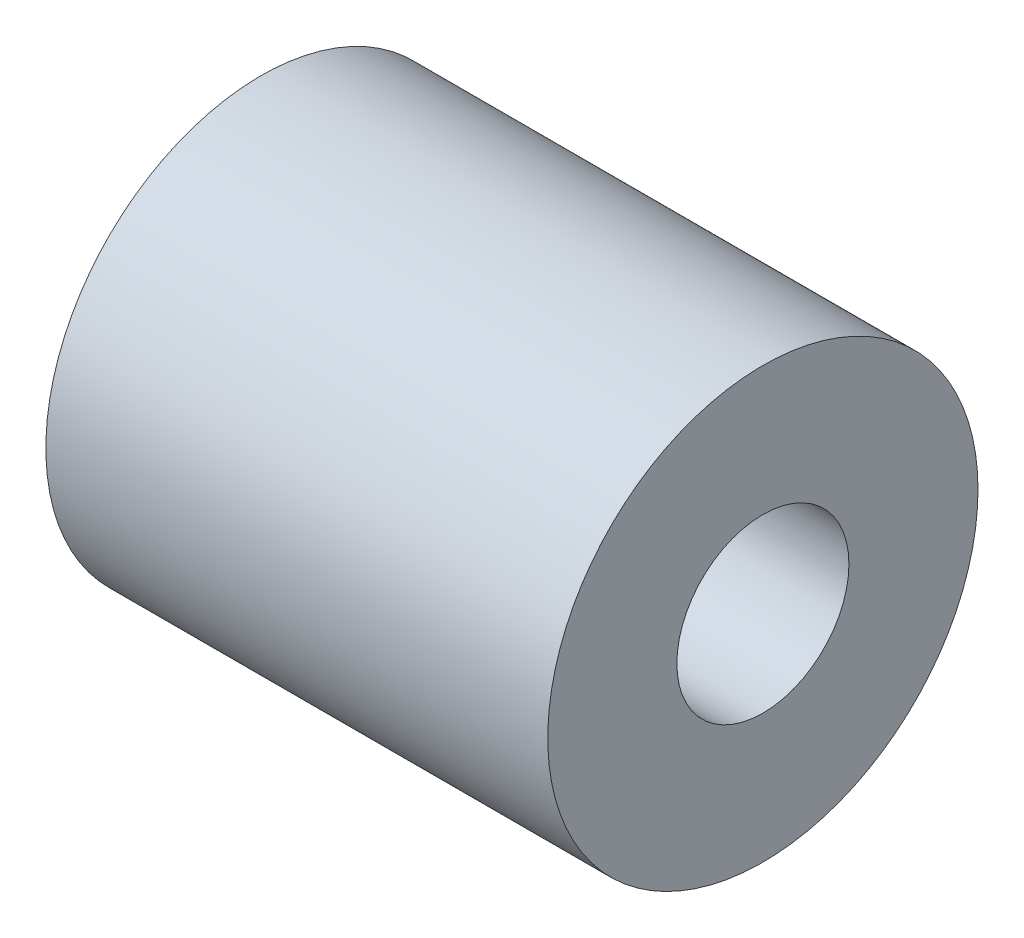
ISO-10303-21;
HEADER;
FILE_DESCRIPTION(('STEP AP214'),'2;1');
FILE_NAME('part.step','',(''),(''),'','','');
FILE_SCHEMA(('AUTOMOTIVE_DESIGN { 1 0 10303 214 1 1 1 1 }'));
ENDSEC;
DATA;
#1=APPLICATION_CONTEXT('core data for automotive mechanical design processes');
#2=APPLICATION_PROTOCOL_DEFINITION('international standard','automotive_design',2000,#1);
#3=PRODUCT_CONTEXT('',#1,'mechanical');
#4=PRODUCT('Part','Part','',(#3));
#5=PRODUCT_RELATED_PRODUCT_CATEGORY('part','',(#4));
#6=PRODUCT_DEFINITION_FORMATION('','',#4);
#7=PRODUCT_DEFINITION_CONTEXT('part definition',#1,'design');
#8=PRODUCT_DEFINITION('design','',#6,#7);
#9=PRODUCT_DEFINITION_SHAPE('','',#8);
#10=(LENGTH_UNIT() NAMED_UNIT(*) SI_UNIT(.MILLI.,.METRE.));
#11=(NAMED_UNIT(*) PLANE_ANGLE_UNIT() SI_UNIT($,.RADIAN.));
#12=(NAMED_UNIT(*) SI_UNIT($,.STERADIAN.) SOLID_ANGLE_UNIT());
#13=UNCERTAINTY_MEASURE_WITH_UNIT(LENGTH_MEASURE(1.E-05),#10,'distance_accuracy_value','');
#14=(GEOMETRIC_REPRESENTATION_CONTEXT(3) GLOBAL_UNCERTAINTY_ASSIGNED_CONTEXT((#13)) GLOBAL_UNIT_ASSIGNED_CONTEXT((#10,
#11,#12)) REPRESENTATION_CONTEXT('',''));
#15=CARTESIAN_POINT('',(0.,0.,0.));
#16=DIRECTION('',(0.,0.,1.));
#17=DIRECTION('',(1.,0.,0.));
#18=AXIS2_PLACEMENT_3D('',#15,#16,#17);
#19=CARTESIAN_POINT('',(17.5,0.,0.));
#20=DIRECTION('',(-1.,0.,0.));
#21=DIRECTION('',(0.,0.,1.));
#22=AXIS2_PLACEMENT_3D('',#19,#20,#21);
#23=CYLINDRICAL_SURFACE('',#22,15.);
#24=CARTESIAN_POINT('',(17.5,0.,0.));
#25=DIRECTION('',(1.,0.,0.));
#26=DIRECTION('',(0.,0.,-1.));
#27=AXIS2_PLACEMENT_3D('',#24,#25,#26);
#28=CIRCLE('',#27,15.);
#29=CARTESIAN_POINT('',(17.5,0.,-15.));
#30=VERTEX_POINT('',#29);
#31=EDGE_CURVE('E10',#30,#30,#28,.T.);
#32=ORIENTED_EDGE('',*,*,#31,.F.);
#33=EDGE_LOOP('',(#32));
#34=FACE_BOUND('',#33,.T.);
#35=CARTESIAN_POINT('',(-17.5,0.,0.));
#36=DIRECTION('',(1.,0.,0.));
#37=DIRECTION('',(0.,0.,-1.));
#38=AXIS2_PLACEMENT_3D('',#35,#36,#37);
#39=CIRCLE('',#38,15.);
#40=CARTESIAN_POINT('',(-17.5,0.,-15.));
#41=VERTEX_POINT('',#40);
#42=EDGE_CURVE('E46',#41,#41,#39,.T.);
#43=ORIENTED_EDGE('',*,*,#42,.T.);
#44=EDGE_LOOP('',(#43));
#45=FACE_BOUND('',#44,.T.);
#46=ADVANCED_FACE('F43',(#34,#45),#23,.T.);
#47=CARTESIAN_POINT('',(17.5,0.,0.));
#48=DIRECTION('',(1.,0.,0.));
#49=DIRECTION('',(0.,0.,-1.));
#50=AXIS2_PLACEMENT_3D('',#47,#48,#49);
#51=PLANE('',#50);
#52=CARTESIAN_POINT('',(17.5,0.,0.));
#53=DIRECTION('',(1.,0.,0.));
#54=DIRECTION('',(0.,0.,-1.));
#55=AXIS2_PLACEMENT_3D('',#52,#53,#54);
#56=CIRCLE('',#55,6.);
#57=CARTESIAN_POINT('',(17.5,0.,-6.));
#58=VERTEX_POINT('',#57);
#59=EDGE_CURVE('E60',#58,#58,#56,.T.);
#60=ORIENTED_EDGE('',*,*,#59,.F.);
#61=EDGE_LOOP('',(#60));
#62=FACE_BOUND('',#61,.T.);
#63=ORIENTED_EDGE('',*,*,#31,.T.);
#64=EDGE_LOOP('',(#63));
#65=FACE_BOUND('',#64,.T.);
#66=ADVANCED_FACE('F88',(#62,#65),#51,.T.);
#67=CARTESIAN_POINT('',(-17.5,0.,0.));
#68=DIRECTION('',(1.,0.,0.));
#69=DIRECTION('',(0.,0.,-1.));
#70=AXIS2_PLACEMENT_3D('',#67,#68,#69);
#71=PLANE('',#70);
#72=CARTESIAN_POINT('',(-17.5,0.,0.));
#73=DIRECTION('',(-1.,0.,0.));
#74=DIRECTION('',(0.,0.,1.));
#75=AXIS2_PLACEMENT_3D('',#72,#73,#74);
#76=CIRCLE('',#75,4.);
#77=CARTESIAN_POINT('',(-17.5,0.,4.));
#78=VERTEX_POINT('',#77);
#79=EDGE_CURVE('E63',#78,#78,#76,.T.);
#80=ORIENTED_EDGE('',*,*,#79,.F.);
#81=EDGE_LOOP('',(#80));
#82=FACE_BOUND('',#81,.T.);
#83=ORIENTED_EDGE('',*,*,#42,.F.);
#84=EDGE_LOOP('',(#83));
#85=FACE_BOUND('',#84,.T.);
#86=ADVANCED_FACE('F85',(#82,#85),#71,.F.);
#87=CARTESIAN_POINT('',(0.,0.,0.));
#88=DIRECTION('',(1.,0.,0.));
#89=DIRECTION('',(0.,0.,-1.));
#90=AXIS2_PLACEMENT_3D('',#87,#88,#89);
#91=CYLINDRICAL_SURFACE('',#90,6.);
#92=CARTESIAN_POINT('',(0.,0.,0.));
#93=DIRECTION('',(1.,0.,0.));
#94=DIRECTION('',(0.,0.,-1.));
#95=AXIS2_PLACEMENT_3D('',#92,#93,#94);
#96=CIRCLE('',#95,6.);
#97=CARTESIAN_POINT('',(0.,0.,-6.));
#98=VERTEX_POINT('',#97);
#99=EDGE_CURVE('E54',#98,#98,#96,.T.);
#100=ORIENTED_EDGE('',*,*,#99,.F.);
#101=EDGE_LOOP('',(#100));
#102=FACE_BOUND('',#101,.T.);
#103=ORIENTED_EDGE('',*,*,#59,.T.);
#104=EDGE_LOOP('',(#103));
#105=FACE_BOUND('',#104,.T.);
#106=ADVANCED_FACE('F83',(#102,#105),#91,.F.);
#107=CARTESIAN_POINT('',(0.,0.,0.));
#108=DIRECTION('',(1.,0.,0.));
#109=DIRECTION('',(0.,0.,-1.));
#110=AXIS2_PLACEMENT_3D('',#107,#108,#109);
#111=PLANE('',#110);
#112=CARTESIAN_POINT('',(0.,0.,0.));
#113=DIRECTION('',(-1.,0.,0.));
#114=DIRECTION('',(0.,0.,1.));
#115=AXIS2_PLACEMENT_3D('',#112,#113,#114);
#116=CIRCLE('',#115,4.);
#117=CARTESIAN_POINT('',(0.,0.,4.));
#118=VERTEX_POINT('',#117);
#119=EDGE_CURVE('E62',#118,#118,#116,.T.);
#120=ORIENTED_EDGE('',*,*,#119,.T.);
#121=EDGE_LOOP('',(#120));
#122=FACE_BOUND('',#121,.T.);
#123=ORIENTED_EDGE('',*,*,#99,.T.);
#124=EDGE_LOOP('',(#123));
#125=FACE_BOUND('',#124,.T.);
#126=ADVANCED_FACE('F71',(#122,#125),#111,.T.);
#127=CARTESIAN_POINT('',(0.,0.,0.));
#128=DIRECTION('',(-1.,0.,0.));
#129=DIRECTION('',(0.,0.,1.));
#130=AXIS2_PLACEMENT_3D('',#127,#128,#129);
#131=CYLINDRICAL_SURFACE('',#130,4.);
#132=ORIENTED_EDGE('',*,*,#119,.F.);
#133=EDGE_LOOP('',(#132));
#134=FACE_BOUND('',#133,.T.);
#135=ORIENTED_EDGE('',*,*,#79,.T.);
#136=EDGE_LOOP('',(#135));
#137=FACE_BOUND('',#136,.T.);
#138=ADVANCED_FACE('F77',(#134,#137),#131,.F.);
#139=CLOSED_SHELL('',(#46,#66,#86,#106,#126,#138));
#140=MANIFOLD_SOLID_BREP('B2',#139);
#141=ADVANCED_BREP_SHAPE_REPRESENTATION('',(#18,#140),#14);
#142=SHAPE_DEFINITION_REPRESENTATION(#9,#141);
ENDSEC;
END-ISO-10303-21;
